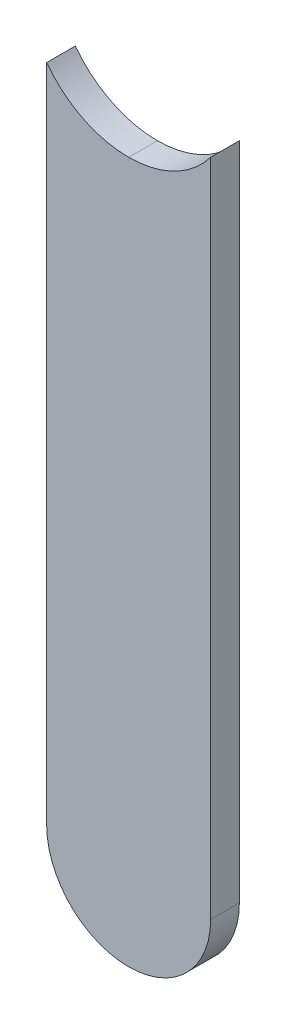
ISO-10303-21;
HEADER;
FILE_DESCRIPTION(('STEP AP214'),'2;1');
FILE_NAME('part.step','',(''),(''),'','','');
FILE_SCHEMA(('AUTOMOTIVE_DESIGN { 1 0 10303 214 1 1 1 1 }'));
ENDSEC;
DATA;
#1=APPLICATION_CONTEXT('core data for automotive mechanical design processes');
#2=APPLICATION_PROTOCOL_DEFINITION('international standard','automotive_design',2000,#1);
#3=PRODUCT_CONTEXT('',#1,'mechanical');
#4=PRODUCT('Part','Part','',(#3));
#5=PRODUCT_RELATED_PRODUCT_CATEGORY('part','',(#4));
#6=PRODUCT_DEFINITION_FORMATION('','',#4);
#7=PRODUCT_DEFINITION_CONTEXT('part definition',#1,'design');
#8=PRODUCT_DEFINITION('design','',#6,#7);
#9=PRODUCT_DEFINITION_SHAPE('','',#8);
#10=(LENGTH_UNIT() NAMED_UNIT(*) SI_UNIT(.MILLI.,.METRE.));
#11=(NAMED_UNIT(*) PLANE_ANGLE_UNIT() SI_UNIT($,.RADIAN.));
#12=(NAMED_UNIT(*) SI_UNIT($,.STERADIAN.) SOLID_ANGLE_UNIT());
#13=UNCERTAINTY_MEASURE_WITH_UNIT(LENGTH_MEASURE(1.E-05),#10,'distance_accuracy_value','');
#14=(GEOMETRIC_REPRESENTATION_CONTEXT(3) GLOBAL_UNCERTAINTY_ASSIGNED_CONTEXT((#13)) GLOBAL_UNIT_ASSIGNED_CONTEXT((#10,
#11,#12)) REPRESENTATION_CONTEXT('',''));
#15=CARTESIAN_POINT('',(0.,0.,0.));
#16=DIRECTION('',(0.,0.,1.));
#17=DIRECTION('',(1.,0.,0.));
#18=AXIS2_PLACEMENT_3D('',#15,#16,#17);
#19=CARTESIAN_POINT('',(86.4275,-104.2775,-0.045));
#20=DIRECTION('',(0.,0.,-1.));
#21=DIRECTION('',(0.,-1.,0.));
#22=AXIS2_PLACEMENT_3D('',#19,#20,#21);
#23=CYLINDRICAL_SURFACE('',#22,0.125);
#24=DIRECTION('',(0.,0.,1.));
#25=VECTOR('',#24,1.);
#26=CARTESIAN_POINT('',(86.4275,-104.4025,-0.045));
#27=LINE('',#26,#25);
#28=CARTESIAN_POINT('',(86.4275,-104.4025,1.6));
#29=VERTEX_POINT('',#28);
#30=CARTESIAN_POINT('',(86.4275,-104.4025,1.635));
#31=VERTEX_POINT('',#30);
#32=EDGE_CURVE('E71',#29,#31,#27,.T.);
#33=ORIENTED_EDGE('',*,*,#32,.F.);
#34=CARTESIAN_POINT('',(86.4275,-104.2775,1.6));
#35=DIRECTION('',(0.,0.,-1.));
#36=DIRECTION('',(0.,-1.,0.));
#37=AXIS2_PLACEMENT_3D('',#34,#35,#36);
#38=CIRCLE('',#37,0.125);
#39=CARTESIAN_POINT('',(86.3275,-104.3524999999,1.6));
#40=VERTEX_POINT('',#39);
#41=EDGE_CURVE('E128',#29,#40,#38,.T.);
#42=ORIENTED_EDGE('',*,*,#41,.T.);
#43=DIRECTION('',(0.,0.,-1.));
#44=VECTOR('',#43,1.);
#45=CARTESIAN_POINT('',(86.3275,-104.3525,-0.045));
#46=LINE('',#45,#44);
#47=CARTESIAN_POINT('',(86.3275,-104.3524999999,1.635));
#48=VERTEX_POINT('',#47);
#49=EDGE_CURVE('E11',#48,#40,#46,.T.);
#50=ORIENTED_EDGE('',*,*,#49,.F.);
#51=CARTESIAN_POINT('',(86.4275,-104.2775,1.635));
#52=DIRECTION('',(0.,0.,-1.));
#53=DIRECTION('',(0.,-1.,0.));
#54=AXIS2_PLACEMENT_3D('',#51,#52,#53);
#55=CIRCLE('',#54,0.125);
#56=EDGE_CURVE('E68',#31,#48,#55,.T.);
#57=ORIENTED_EDGE('',*,*,#56,.F.);
#58=EDGE_LOOP('',(#33,#42,#50,#57));
#59=FACE_BOUND('',#58,.T.);
#60=ADVANCED_FACE('F17',(#59),#23,.F.);
#61=CARTESIAN_POINT('',(86.3275,-104.2775,1.6));
#62=DIRECTION('',(1.,0.,0.));
#63=DIRECTION('',(0.,1.,0.));
#64=AXIS2_PLACEMENT_3D('',#61,#62,#63);
#65=PLANE('',#64);
#66=DIRECTION('',(0.,0.,1.));
#67=VECTOR('',#66,1.);
#68=CARTESIAN_POINT('',(86.3275,-105.1575,1.6));
#69=LINE('',#68,#67);
#70=CARTESIAN_POINT('',(86.3275,-105.1575,1.6));
#71=VERTEX_POINT('',#70);
#72=CARTESIAN_POINT('',(86.3275,-105.1575,1.635));
#73=VERTEX_POINT('',#72);
#74=EDGE_CURVE('E26',#71,#73,#69,.T.);
#75=ORIENTED_EDGE('',*,*,#74,.T.);
#76=DIRECTION('',(0.,-1.,0.));
#77=VECTOR('',#76,1.);
#78=CARTESIAN_POINT('',(86.3275,-104.2775,1.635));
#79=LINE('',#78,#77);
#80=EDGE_CURVE('E76',#48,#73,#79,.T.);
#81=ORIENTED_EDGE('',*,*,#80,.F.);
#82=ORIENTED_EDGE('',*,*,#49,.T.);
#83=DIRECTION('',(0.,-1.,0.));
#84=VECTOR('',#83,1.);
#85=CARTESIAN_POINT('',(86.3275,-104.2775,1.6));
#86=LINE('',#85,#84);
#87=EDGE_CURVE('E125',#40,#71,#86,.T.);
#88=ORIENTED_EDGE('',*,*,#87,.T.);
#89=EDGE_LOOP('',(#75,#81,#82,#88));
#90=FACE_BOUND('',#89,.T.);
#91=ADVANCED_FACE('F171',(#90),#65,.F.);
#92=CARTESIAN_POINT('',(86.4275,-105.1575,1.6));
#93=DIRECTION('',(0.,0.,-1.));
#94=DIRECTION('',(-1.,0.,0.));
#95=AXIS2_PLACEMENT_3D('',#92,#93,#94);
#96=CYLINDRICAL_SURFACE('',#95,0.1);
#97=CARTESIAN_POINT('',(86.4275,-105.1575,1.6));
#98=DIRECTION('',(0.,0.,1.));
#99=DIRECTION('',(-1.,0.,0.));
#100=AXIS2_PLACEMENT_3D('',#97,#98,#99);
#101=CIRCLE('',#100,0.1);
#102=CARTESIAN_POINT('',(86.5275,-105.1575,1.6));
#103=VERTEX_POINT('',#102);
#104=EDGE_CURVE('E94',#71,#103,#101,.T.);
#105=ORIENTED_EDGE('',*,*,#104,.T.);
#106=DIRECTION('',(0.,0.,1.));
#107=VECTOR('',#106,1.);
#108=CARTESIAN_POINT('',(86.5275,-105.1575,1.6));
#109=LINE('',#108,#107);
#110=CARTESIAN_POINT('',(86.5275,-105.1575,1.635));
#111=VERTEX_POINT('',#110);
#112=EDGE_CURVE('E117',#103,#111,#109,.T.);
#113=ORIENTED_EDGE('',*,*,#112,.T.);
#114=CARTESIAN_POINT('',(86.4275,-105.1575,1.635));
#115=DIRECTION('',(0.,0.,1.));
#116=DIRECTION('',(-1.,0.,0.));
#117=AXIS2_PLACEMENT_3D('',#114,#115,#116);
#118=CIRCLE('',#117,0.1);
#119=EDGE_CURVE('E77',#73,#111,#118,.T.);
#120=ORIENTED_EDGE('',*,*,#119,.F.);
#121=ORIENTED_EDGE('',*,*,#74,.F.);
#122=EDGE_LOOP('',(#105,#113,#120,#121));
#123=FACE_BOUND('',#122,.T.);
#124=ADVANCED_FACE('F178',(#123),#96,.T.);
#125=CARTESIAN_POINT('',(86.5275,-105.1575,1.635));
#126=DIRECTION('',(0.,0.,1.));
#127=DIRECTION('',(1.,0.,0.));
#128=AXIS2_PLACEMENT_3D('',#125,#126,#127);
#129=PLANE('',#128);
#130=ORIENTED_EDGE('',*,*,#119,.T.);
#131=DIRECTION('',(0.,1.,0.));
#132=VECTOR('',#131,1.);
#133=CARTESIAN_POINT('',(86.5275,-105.1575,1.635));
#134=LINE('',#133,#132);
#135=CARTESIAN_POINT('',(86.5275,-104.3525,1.635));
#136=VERTEX_POINT('',#135);
#137=EDGE_CURVE('E84',#111,#136,#134,.T.);
#138=ORIENTED_EDGE('',*,*,#137,.T.);
#139=CARTESIAN_POINT('',(86.4275,-104.2775,1.635));
#140=DIRECTION('',(0.,0.,-1.));
#141=DIRECTION('',(0.,-1.,0.));
#142=AXIS2_PLACEMENT_3D('',#139,#140,#141);
#143=CIRCLE('',#142,0.125);
#144=EDGE_CURVE('E81',#136,#31,#143,.T.);
#145=ORIENTED_EDGE('',*,*,#144,.T.);
#146=ORIENTED_EDGE('',*,*,#56,.T.);
#147=ORIENTED_EDGE('',*,*,#80,.T.);
#148=EDGE_LOOP('',(#130,#138,#145,#146,#147));
#149=FACE_BOUND('',#148,.T.);
#150=ADVANCED_FACE('F82',(#149),#129,.T.);
#151=CARTESIAN_POINT('',(86.4275,-104.2775,-0.045));
#152=DIRECTION('',(0.,0.,-1.));
#153=DIRECTION('',(0.,-1.,0.));
#154=AXIS2_PLACEMENT_3D('',#151,#152,#153);
#155=CYLINDRICAL_SURFACE('',#154,0.125);
#156=CARTESIAN_POINT('',(86.4275,-104.2775,1.6));
#157=DIRECTION('',(0.,0.,-1.));
#158=DIRECTION('',(0.,-1.,0.));
#159=AXIS2_PLACEMENT_3D('',#156,#157,#158);
#160=CIRCLE('',#159,0.125);
#161=CARTESIAN_POINT('',(86.5275,-104.3525,1.6));
#162=VERTEX_POINT('',#161);
#163=EDGE_CURVE('E91',#162,#29,#160,.T.);
#164=ORIENTED_EDGE('',*,*,#163,.T.);
#165=ORIENTED_EDGE('',*,*,#32,.T.);
#166=ORIENTED_EDGE('',*,*,#144,.F.);
#167=DIRECTION('',(0.,0.,-1.));
#168=VECTOR('',#167,1.);
#169=CARTESIAN_POINT('',(86.5275,-104.3525,-0.045));
#170=LINE('',#169,#168);
#171=EDGE_CURVE('E115',#136,#162,#170,.T.);
#172=ORIENTED_EDGE('',*,*,#171,.T.);
#173=EDGE_LOOP('',(#164,#165,#166,#172));
#174=FACE_BOUND('',#173,.T.);
#175=ADVANCED_FACE('F90',(#174),#155,.F.);
#176=CARTESIAN_POINT('',(86.5275,-105.1575,1.6));
#177=DIRECTION('',(0.,0.,1.));
#178=DIRECTION('',(1.,0.,0.));
#179=AXIS2_PLACEMENT_3D('',#176,#177,#178);
#180=PLANE('',#179);
#181=ORIENTED_EDGE('',*,*,#87,.F.);
#182=ORIENTED_EDGE('',*,*,#41,.F.);
#183=ORIENTED_EDGE('',*,*,#163,.F.);
#184=DIRECTION('',(0.,1.,0.));
#185=VECTOR('',#184,1.);
#186=CARTESIAN_POINT('',(86.5275,-105.1575,1.6));
#187=LINE('',#186,#185);
#188=EDGE_CURVE('E121',#103,#162,#187,.T.);
#189=ORIENTED_EDGE('',*,*,#188,.F.);
#190=ORIENTED_EDGE('',*,*,#104,.F.);
#191=EDGE_LOOP('',(#181,#182,#183,#189,#190));
#192=FACE_BOUND('',#191,.T.);
#193=ADVANCED_FACE('F200',(#192),#180,.F.);
#194=CARTESIAN_POINT('',(86.5275,-105.1575,1.6));
#195=DIRECTION('',(-1.,0.,0.));
#196=DIRECTION('',(0.,0.,1.));
#197=AXIS2_PLACEMENT_3D('',#194,#195,#196);
#198=PLANE('',#197);
#199=ORIENTED_EDGE('',*,*,#171,.F.);
#200=ORIENTED_EDGE('',*,*,#137,.F.);
#201=ORIENTED_EDGE('',*,*,#112,.F.);
#202=ORIENTED_EDGE('',*,*,#188,.T.);
#203=EDGE_LOOP('',(#199,#200,#201,#202));
#204=FACE_BOUND('',#203,.T.);
#205=ADVANCED_FACE('F162',(#204),#198,.F.);
#206=CLOSED_SHELL('',(#60,#91,#124,#150,#175,#193,#205));
#207=MANIFOLD_SOLID_BREP('B1',#206);
#208=ADVANCED_BREP_SHAPE_REPRESENTATION('',(#18,#207),#14);
#209=SHAPE_DEFINITION_REPRESENTATION(#9,#208);
ENDSEC;
END-ISO-10303-21;
